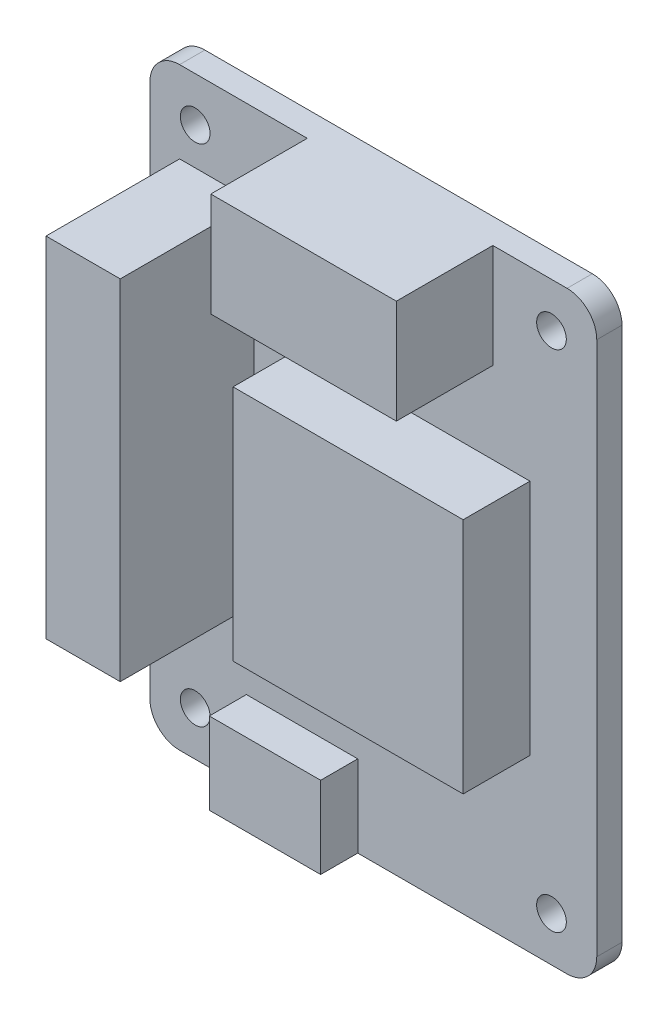
ISO-10303-21;
HEADER;
FILE_DESCRIPTION(('STEP AP214'),'2;1');
FILE_NAME('part.step','',(''),(''),'','','');
FILE_SCHEMA(('AUTOMOTIVE_DESIGN { 1 0 10303 214 1 1 1 1 }'));
ENDSEC;
DATA;
#1=APPLICATION_CONTEXT('core data for automotive mechanical design processes');
#2=APPLICATION_PROTOCOL_DEFINITION('international standard','automotive_design',2000,#1);
#3=PRODUCT_CONTEXT('',#1,'mechanical');
#4=PRODUCT('Part','Part','',(#3));
#5=PRODUCT_RELATED_PRODUCT_CATEGORY('part','',(#4));
#6=PRODUCT_DEFINITION_FORMATION('','',#4);
#7=PRODUCT_DEFINITION_CONTEXT('part definition',#1,'design');
#8=PRODUCT_DEFINITION('design','',#6,#7);
#9=PRODUCT_DEFINITION_SHAPE('','',#8);
#10=(LENGTH_UNIT() NAMED_UNIT(*) SI_UNIT(.MILLI.,.METRE.));
#11=(NAMED_UNIT(*) PLANE_ANGLE_UNIT() SI_UNIT($,.RADIAN.));
#12=(NAMED_UNIT(*) SI_UNIT($,.STERADIAN.) SOLID_ANGLE_UNIT());
#13=UNCERTAINTY_MEASURE_WITH_UNIT(LENGTH_MEASURE(1.E-05),#10,'distance_accuracy_value','');
#14=(GEOMETRIC_REPRESENTATION_CONTEXT(3) GLOBAL_UNCERTAINTY_ASSIGNED_CONTEXT((#13)) GLOBAL_UNIT_ASSIGNED_CONTEXT((#10,
#11,#12)) REPRESENTATION_CONTEXT('',''));
#15=CARTESIAN_POINT('',(0.,0.,0.));
#16=DIRECTION('',(0.,0.,1.));
#17=DIRECTION('',(1.,0.,0.));
#18=AXIS2_PLACEMENT_3D('',#15,#16,#17);
#19=CARTESIAN_POINT('',(0.,0.,1.7));
#20=DIRECTION('',(0.,0.,1.));
#21=DIRECTION('',(1.,0.,0.));
#22=AXIS2_PLACEMENT_3D('',#19,#20,#21);
#23=PLANE('',#22);
#24=CARTESIAN_POINT('',(-12.,-17.,1.7));
#25=DIRECTION('',(0.,0.,1.));
#26=DIRECTION('',(1.,0.,0.));
#27=AXIS2_PLACEMENT_3D('',#24,#25,#26);
#28=CIRCLE('',#27,1.);
#29=CARTESIAN_POINT('',(-11.,-17.,1.7));
#30=VERTEX_POINT('',#29);
#31=EDGE_CURVE('E321',#30,#30,#28,.T.);
#32=ORIENTED_EDGE('',*,*,#31,.F.);
#33=EDGE_LOOP('',(#32));
#34=FACE_BOUND('',#33,.T.);
#35=CARTESIAN_POINT('',(12.,17.,1.7));
#36=DIRECTION('',(0.,0.,1.));
#37=DIRECTION('',(1.,0.,0.));
#38=AXIS2_PLACEMENT_3D('',#35,#36,#37);
#39=CIRCLE('',#38,1.);
#40=CARTESIAN_POINT('',(13.,17.,1.7));
#41=VERTEX_POINT('',#40);
#42=EDGE_CURVE('E333',#41,#41,#39,.T.);
#43=ORIENTED_EDGE('',*,*,#42,.F.);
#44=EDGE_LOOP('',(#43));
#45=FACE_BOUND('',#44,.T.);
#46=CARTESIAN_POINT('',(-12.,17.,1.7));
#47=DIRECTION('',(0.,0.,1.));
#48=DIRECTION('',(1.,0.,0.));
#49=AXIS2_PLACEMENT_3D('',#46,#47,#48);
#50=CIRCLE('',#49,1.);
#51=CARTESIAN_POINT('',(-11.,17.,1.7));
#52=VERTEX_POINT('',#51);
#53=EDGE_CURVE('E327',#52,#52,#50,.T.);
#54=ORIENTED_EDGE('',*,*,#53,.F.);
#55=EDGE_LOOP('',(#54));
#56=FACE_BOUND('',#55,.T.);
#57=CARTESIAN_POINT('',(12.,-17.,1.7));
#58=DIRECTION('',(0.,0.,1.));
#59=DIRECTION('',(1.,0.,0.));
#60=AXIS2_PLACEMENT_3D('',#57,#58,#59);
#61=CIRCLE('',#60,1.);
#62=CARTESIAN_POINT('',(13.,-17.,1.7));
#63=VERTEX_POINT('',#62);
#64=EDGE_CURVE('E315',#63,#63,#61,.T.);
#65=ORIENTED_EDGE('',*,*,#64,.F.);
#66=EDGE_LOOP('',(#65));
#67=FACE_BOUND('',#66,.T.);
#68=DIRECTION('',(1.,0.,0.));
#69=VECTOR('',#68,1.);
#70=CARTESIAN_POINT('',(-8.05,-9.,1.7));
#71=LINE('',#70,#69);
#72=CARTESIAN_POINT('',(-13.05,-9.,1.7));
#73=VERTEX_POINT('',#72);
#74=CARTESIAN_POINT('',(-8.05,-9.,1.7));
#75=VERTEX_POINT('',#74);
#76=EDGE_CURVE('E299',#73,#75,#71,.T.);
#77=ORIENTED_EDGE('',*,*,#76,.F.);
#78=DIRECTION('',(0.,-1.,0.));
#79=VECTOR('',#78,1.);
#80=CARTESIAN_POINT('',(-13.05,-9.,1.7));
#81=LINE('',#80,#79);
#82=CARTESIAN_POINT('',(-13.05,14.5,1.7));
#83=VERTEX_POINT('',#82);
#84=EDGE_CURVE('E285',#83,#73,#81,.T.);
#85=ORIENTED_EDGE('',*,*,#84,.F.);
#86=DIRECTION('',(-1.,0.,0.));
#87=VECTOR('',#86,1.);
#88=CARTESIAN_POINT('',(-8.05,14.5,1.7));
#89=LINE('',#88,#87);
#90=CARTESIAN_POINT('',(-8.05,14.5,1.7));
#91=VERTEX_POINT('',#90);
#92=EDGE_CURVE('E290',#91,#83,#89,.T.);
#93=ORIENTED_EDGE('',*,*,#92,.F.);
#94=DIRECTION('',(0.,1.,0.));
#95=VECTOR('',#94,1.);
#96=CARTESIAN_POINT('',(-8.05,-9.,1.7));
#97=LINE('',#96,#95);
#98=EDGE_CURVE('E301',#75,#91,#97,.T.);
#99=ORIENTED_EDGE('',*,*,#98,.F.);
#100=EDGE_LOOP('',(#77,#85,#93,#99));
#101=FACE_BOUND('',#100,.T.);
#102=DIRECTION('',(1.,0.,0.));
#103=VECTOR('',#102,1.);
#104=CARTESIAN_POINT('',(10.55,-8.5,1.7));
#105=LINE('',#104,#103);
#106=CARTESIAN_POINT('',(-4.95,-8.5,1.7));
#107=VERTEX_POINT('',#106);
#108=CARTESIAN_POINT('',(10.55,-8.5,1.7));
#109=VERTEX_POINT('',#108);
#110=EDGE_CURVE('E270',#107,#109,#105,.T.);
#111=ORIENTED_EDGE('',*,*,#110,.F.);
#112=DIRECTION('',(0.,-1.,0.));
#113=VECTOR('',#112,1.);
#114=CARTESIAN_POINT('',(-4.95,-8.5,1.7));
#115=LINE('',#114,#113);
#116=CARTESIAN_POINT('',(-4.95,7.5,1.7));
#117=VERTEX_POINT('',#116);
#118=EDGE_CURVE('E256',#117,#107,#115,.T.);
#119=ORIENTED_EDGE('',*,*,#118,.F.);
#120=DIRECTION('',(-1.,0.,0.));
#121=VECTOR('',#120,1.);
#122=CARTESIAN_POINT('',(10.55,7.5,1.7));
#123=LINE('',#122,#121);
#124=CARTESIAN_POINT('',(10.55,7.5,1.7));
#125=VERTEX_POINT('',#124);
#126=EDGE_CURVE('E261',#125,#117,#123,.T.);
#127=ORIENTED_EDGE('',*,*,#126,.F.);
#128=DIRECTION('',(0.,1.,0.));
#129=VECTOR('',#128,1.);
#130=CARTESIAN_POINT('',(10.55,-8.5,1.7));
#131=LINE('',#130,#129);
#132=EDGE_CURVE('E272',#109,#125,#131,.T.);
#133=ORIENTED_EDGE('',*,*,#132,.F.);
#134=EDGE_LOOP('',(#111,#119,#127,#133));
#135=FACE_BOUND('',#134,.T.);
#136=DIRECTION('',(0.,-1.,0.));
#137=VECTOR('',#136,1.);
#138=CARTESIAN_POINT('',(-15.05,-20.,1.7));
#139=LINE('',#138,#137);
#140=CARTESIAN_POINT('',(-15.05,18.,1.7));
#141=VERTEX_POINT('',#140);
#142=CARTESIAN_POINT('',(-15.05,-18.,1.7));
#143=VERTEX_POINT('',#142);
#144=EDGE_CURVE('E339',#141,#143,#139,.T.);
#145=ORIENTED_EDGE('',*,*,#144,.T.);
#146=CARTESIAN_POINT('',(-13.05,-18.,1.7));
#147=DIRECTION('',(0.,0.,1.));
#148=DIRECTION('',(1.,0.,0.));
#149=AXIS2_PLACEMENT_3D('',#146,#147,#148);
#150=CIRCLE('',#149,2.);
#151=CARTESIAN_POINT('',(-13.05,-20.,1.7));
#152=VERTEX_POINT('',#151);
#153=EDGE_CURVE('E382',#143,#152,#150,.T.);
#154=ORIENTED_EDGE('',*,*,#153,.T.);
#155=DIRECTION('',(1.,0.,0.));
#156=VECTOR('',#155,1.);
#157=CARTESIAN_POINT('',(15.05,-20.,1.7));
#158=LINE('',#157,#156);
#159=CARTESIAN_POINT('',(-8.55,-20.,1.7));
#160=VERTEX_POINT('',#159);
#161=EDGE_CURVE('E343',#152,#160,#158,.T.);
#162=ORIENTED_EDGE('',*,*,#161,.T.);
#163=DIRECTION('',(0.,-1.,0.));
#164=VECTOR('',#163,1.);
#165=CARTESIAN_POINT('',(-8.55,-20.,1.7));
#166=LINE('',#165,#164);
#167=CARTESIAN_POINT('',(-8.55,-14.5,1.7));
#168=VERTEX_POINT('',#167);
#169=EDGE_CURVE('E214',#168,#160,#166,.T.);
#170=ORIENTED_EDGE('',*,*,#169,.F.);
#171=DIRECTION('',(-1.,0.,0.));
#172=VECTOR('',#171,1.);
#173=CARTESIAN_POINT('',(-8.55,-14.5,1.7));
#174=LINE('',#173,#172);
#175=CARTESIAN_POINT('',(-1.05,-14.5,1.7));
#176=VERTEX_POINT('',#175);
#177=EDGE_CURVE('E773',#176,#168,#174,.T.);
#178=ORIENTED_EDGE('',*,*,#177,.F.);
#179=DIRECTION('',(0.,1.,0.));
#180=VECTOR('',#179,1.);
#181=CARTESIAN_POINT('',(-1.05,-14.5,1.7));
#182=LINE('',#181,#180);
#183=CARTESIAN_POINT('',(-1.05,-20.,1.7));
#184=VERTEX_POINT('',#183);
#185=EDGE_CURVE('E775',#184,#176,#182,.T.);
#186=ORIENTED_EDGE('',*,*,#185,.F.);
#187=CARTESIAN_POINT('',(13.05,-20.,1.7));
#188=VERTEX_POINT('',#187);
#189=EDGE_CURVE('E219',#184,#188,#158,.T.);
#190=ORIENTED_EDGE('',*,*,#189,.T.);
#191=CARTESIAN_POINT('',(13.05,-18.,1.7));
#192=DIRECTION('',(0.,0.,1.));
#193=DIRECTION('',(1.,0.,0.));
#194=AXIS2_PLACEMENT_3D('',#191,#192,#193);
#195=CIRCLE('',#194,2.);
#196=CARTESIAN_POINT('',(15.05,-18.,1.7));
#197=VERTEX_POINT('',#196);
#198=EDGE_CURVE('E380',#188,#197,#195,.T.);
#199=ORIENTED_EDGE('',*,*,#198,.T.);
#200=DIRECTION('',(0.,1.,0.));
#201=VECTOR('',#200,1.);
#202=CARTESIAN_POINT('',(15.05,-20.,1.7));
#203=LINE('',#202,#201);
#204=CARTESIAN_POINT('',(15.05,18.,1.7));
#205=VERTEX_POINT('',#204);
#206=EDGE_CURVE('E345',#197,#205,#203,.T.);
#207=ORIENTED_EDGE('',*,*,#206,.T.);
#208=CARTESIAN_POINT('',(13.05,18.,1.7));
#209=DIRECTION('',(0.,0.,1.));
#210=DIRECTION('',(1.,0.,0.));
#211=AXIS2_PLACEMENT_3D('',#208,#209,#210);
#212=CIRCLE('',#211,2.);
#213=CARTESIAN_POINT('',(13.05,20.,1.7));
#214=VERTEX_POINT('',#213);
#215=EDGE_CURVE('E54',#205,#214,#212,.T.);
#216=ORIENTED_EDGE('',*,*,#215,.T.);
#217=DIRECTION('',(-1.,0.,0.));
#218=VECTOR('',#217,1.);
#219=CARTESIAN_POINT('',(15.05,20.,1.7));
#220=LINE('',#219,#218);
#221=CARTESIAN_POINT('',(8.05,20.,1.7));
#222=VERTEX_POINT('',#221);
#223=EDGE_CURVE('E348',#214,#222,#220,.T.);
#224=ORIENTED_EDGE('',*,*,#223,.T.);
#225=DIRECTION('',(0.,1.,0.));
#226=VECTOR('',#225,1.);
#227=CARTESIAN_POINT('',(8.05,13.,1.7));
#228=LINE('',#227,#226);
#229=CARTESIAN_POINT('',(8.05,13.,1.7));
#230=VERTEX_POINT('',#229);
#231=EDGE_CURVE('E234',#230,#222,#228,.T.);
#232=ORIENTED_EDGE('',*,*,#231,.F.);
#233=DIRECTION('',(1.,0.,0.));
#234=VECTOR('',#233,1.);
#235=CARTESIAN_POINT('',(-4.44999999999999,13.,1.7));
#236=LINE('',#235,#234);
#237=CARTESIAN_POINT('',(-4.44999999999999,13.,1.7));
#238=VERTEX_POINT('',#237);
#239=EDGE_CURVE('E224',#238,#230,#236,.T.);
#240=ORIENTED_EDGE('',*,*,#239,.F.);
#241=DIRECTION('',(0.,-1.,0.));
#242=VECTOR('',#241,1.);
#243=CARTESIAN_POINT('',(-4.45,20.,1.7));
#244=LINE('',#243,#242);
#245=CARTESIAN_POINT('',(-4.45,20.,1.7));
#246=VERTEX_POINT('',#245);
#247=EDGE_CURVE('E221',#246,#238,#244,.T.);
#248=ORIENTED_EDGE('',*,*,#247,.F.);
#249=CARTESIAN_POINT('',(-13.05,20.,1.7));
#250=VERTEX_POINT('',#249);
#251=EDGE_CURVE('E347',#246,#250,#220,.T.);
#252=ORIENTED_EDGE('',*,*,#251,.T.);
#253=CARTESIAN_POINT('',(-13.05,18.,1.7));
#254=DIRECTION('',(0.,0.,1.));
#255=DIRECTION('',(1.,0.,0.));
#256=AXIS2_PLACEMENT_3D('',#253,#254,#255);
#257=CIRCLE('',#256,2.);
#258=EDGE_CURVE('E378',#250,#141,#257,.T.);
#259=ORIENTED_EDGE('',*,*,#258,.T.);
#260=EDGE_LOOP('',(#145,#154,#162,#170,#178,#186,#190,#199,#207,#216,#224,#232,#240,#248,#252,#259));
#261=FACE_BOUND('',#260,.T.);
#262=ADVANCED_FACE('F33',(#34,#45,#56,#67,#101,#135,#261),#23,.T.);
#263=CARTESIAN_POINT('',(0.,0.,0.));
#264=DIRECTION('',(0.,0.,1.));
#265=DIRECTION('',(1.,0.,0.));
#266=AXIS2_PLACEMENT_3D('',#263,#264,#265);
#267=PLANE('',#266);
#268=DIRECTION('',(1.,0.,0.));
#269=VECTOR('',#268,1.);
#270=CARTESIAN_POINT('',(15.05,-20.,0.));
#271=LINE('',#270,#269);
#272=CARTESIAN_POINT('',(-13.05,-20.,0.));
#273=VERTEX_POINT('',#272);
#274=CARTESIAN_POINT('',(13.05,-20.,0.));
#275=VERTEX_POINT('',#274);
#276=EDGE_CURVE('E353',#273,#275,#271,.T.);
#277=ORIENTED_EDGE('',*,*,#276,.F.);
#278=CARTESIAN_POINT('',(-13.05,-18.,0.));
#279=DIRECTION('',(0.,0.,1.));
#280=DIRECTION('',(1.,0.,0.));
#281=AXIS2_PLACEMENT_3D('',#278,#279,#280);
#282=CIRCLE('',#281,2.);
#283=CARTESIAN_POINT('',(-15.05,-18.,0.));
#284=VERTEX_POINT('',#283);
#285=EDGE_CURVE('E370',#273,#284,#282,.F.);
#286=ORIENTED_EDGE('',*,*,#285,.T.);
#287=DIRECTION('',(0.,-1.,0.));
#288=VECTOR('',#287,1.);
#289=CARTESIAN_POINT('',(-15.05,-20.,0.));
#290=LINE('',#289,#288);
#291=CARTESIAN_POINT('',(-15.05,18.,0.));
#292=VERTEX_POINT('',#291);
#293=EDGE_CURVE('E336',#292,#284,#290,.T.);
#294=ORIENTED_EDGE('',*,*,#293,.F.);
#295=CARTESIAN_POINT('',(-13.05,18.,0.));
#296=DIRECTION('',(0.,0.,1.));
#297=DIRECTION('',(1.,0.,0.));
#298=AXIS2_PLACEMENT_3D('',#295,#296,#297);
#299=CIRCLE('',#298,2.);
#300=CARTESIAN_POINT('',(-13.05,20.,0.));
#301=VERTEX_POINT('',#300);
#302=EDGE_CURVE('E366',#292,#301,#299,.F.);
#303=ORIENTED_EDGE('',*,*,#302,.T.);
#304=DIRECTION('',(-1.,0.,0.));
#305=VECTOR('',#304,1.);
#306=CARTESIAN_POINT('',(15.05,20.,0.));
#307=LINE('',#306,#305);
#308=CARTESIAN_POINT('',(13.05,20.,0.));
#309=VERTEX_POINT('',#308);
#310=EDGE_CURVE('E342',#309,#301,#307,.T.);
#311=ORIENTED_EDGE('',*,*,#310,.F.);
#312=CARTESIAN_POINT('',(13.05,18.,0.));
#313=DIRECTION('',(0.,0.,1.));
#314=DIRECTION('',(1.,0.,0.));
#315=AXIS2_PLACEMENT_3D('',#312,#313,#314);
#316=CIRCLE('',#315,2.);
#317=CARTESIAN_POINT('',(15.05,18.,0.));
#318=VERTEX_POINT('',#317);
#319=EDGE_CURVE('E364',#309,#318,#316,.F.);
#320=ORIENTED_EDGE('',*,*,#319,.T.);
#321=DIRECTION('',(0.,1.,0.));
#322=VECTOR('',#321,1.);
#323=CARTESIAN_POINT('',(15.05,-20.,0.));
#324=LINE('',#323,#322);
#325=CARTESIAN_POINT('',(15.05,-18.,0.));
#326=VERTEX_POINT('',#325);
#327=EDGE_CURVE('E356',#326,#318,#324,.T.);
#328=ORIENTED_EDGE('',*,*,#327,.F.);
#329=CARTESIAN_POINT('',(13.05,-18.,0.));
#330=DIRECTION('',(0.,0.,1.));
#331=DIRECTION('',(1.,0.,0.));
#332=AXIS2_PLACEMENT_3D('',#329,#330,#331);
#333=CIRCLE('',#332,2.);
#334=EDGE_CURVE('E368',#326,#275,#333,.F.);
#335=ORIENTED_EDGE('',*,*,#334,.T.);
#336=EDGE_LOOP('',(#277,#286,#294,#303,#311,#320,#328,#335));
#337=FACE_BOUND('',#336,.T.);
#338=CARTESIAN_POINT('',(12.,17.,0.));
#339=DIRECTION('',(0.,0.,1.));
#340=DIRECTION('',(1.,0.,0.));
#341=AXIS2_PLACEMENT_3D('',#338,#339,#340);
#342=CIRCLE('',#341,1.);
#343=CARTESIAN_POINT('',(13.,17.,0.));
#344=VERTEX_POINT('',#343);
#345=EDGE_CURVE('E330',#344,#344,#342,.T.);
#346=ORIENTED_EDGE('',*,*,#345,.T.);
#347=EDGE_LOOP('',(#346));
#348=FACE_BOUND('',#347,.T.);
#349=CARTESIAN_POINT('',(-12.,17.,0.));
#350=DIRECTION('',(0.,0.,1.));
#351=DIRECTION('',(1.,0.,0.));
#352=AXIS2_PLACEMENT_3D('',#349,#350,#351);
#353=CIRCLE('',#352,1.);
#354=CARTESIAN_POINT('',(-11.,17.,0.));
#355=VERTEX_POINT('',#354);
#356=EDGE_CURVE('E324',#355,#355,#353,.T.);
#357=ORIENTED_EDGE('',*,*,#356,.T.);
#358=EDGE_LOOP('',(#357));
#359=FACE_BOUND('',#358,.T.);
#360=CARTESIAN_POINT('',(-12.,-17.,0.));
#361=DIRECTION('',(0.,0.,1.));
#362=DIRECTION('',(1.,0.,0.));
#363=AXIS2_PLACEMENT_3D('',#360,#361,#362);
#364=CIRCLE('',#363,1.);
#365=CARTESIAN_POINT('',(-11.,-17.,0.));
#366=VERTEX_POINT('',#365);
#367=EDGE_CURVE('E318',#366,#366,#364,.T.);
#368=ORIENTED_EDGE('',*,*,#367,.T.);
#369=EDGE_LOOP('',(#368));
#370=FACE_BOUND('',#369,.T.);
#371=CARTESIAN_POINT('',(12.,-17.,0.));
#372=DIRECTION('',(0.,0.,1.));
#373=DIRECTION('',(1.,0.,0.));
#374=AXIS2_PLACEMENT_3D('',#371,#372,#373);
#375=CIRCLE('',#374,1.);
#376=CARTESIAN_POINT('',(13.,-17.,0.));
#377=VERTEX_POINT('',#376);
#378=EDGE_CURVE('E314',#377,#377,#375,.T.);
#379=ORIENTED_EDGE('',*,*,#378,.T.);
#380=EDGE_LOOP('',(#379));
#381=FACE_BOUND('',#380,.T.);
#382=ADVANCED_FACE('F395',(#337,#348,#359,#370,#381),#267,.F.);
#383=CARTESIAN_POINT('',(-15.05,-20.,1.7));
#384=DIRECTION('',(1.,0.,0.));
#385=DIRECTION('',(0.,0.,-1.));
#386=AXIS2_PLACEMENT_3D('',#383,#384,#385);
#387=PLANE('',#386);
#388=ORIENTED_EDGE('',*,*,#293,.T.);
#389=DIRECTION('',(0.,0.,-1.));
#390=VECTOR('',#389,1.);
#391=CARTESIAN_POINT('',(-15.05,-18.,1.7));
#392=LINE('',#391,#390);
#393=EDGE_CURVE('E375',#284,#143,#392,.F.);
#394=ORIENTED_EDGE('',*,*,#393,.T.);
#395=ORIENTED_EDGE('',*,*,#144,.F.);
#396=DIRECTION('',(0.,0.,-1.));
#397=VECTOR('',#396,1.);
#398=CARTESIAN_POINT('',(-15.05,18.,1.7));
#399=LINE('',#398,#397);
#400=EDGE_CURVE('E372',#141,#292,#399,.T.);
#401=ORIENTED_EDGE('',*,*,#400,.T.);
#402=EDGE_LOOP('',(#388,#394,#395,#401));
#403=FACE_BOUND('',#402,.T.);
#404=ADVANCED_FACE('F405',(#403),#387,.F.);
#405=CARTESIAN_POINT('',(15.05,-20.,1.7));
#406=DIRECTION('',(0.,1.,0.));
#407=DIRECTION('',(-1.,0.,0.));
#408=AXIS2_PLACEMENT_3D('',#405,#406,#407);
#409=PLANE('',#408);
#410=ORIENTED_EDGE('',*,*,#161,.F.);
#411=DIRECTION('',(0.,0.,-1.));
#412=VECTOR('',#411,1.);
#413=CARTESIAN_POINT('',(-13.05,-20.,1.7));
#414=LINE('',#413,#412);
#415=EDGE_CURVE('E361',#152,#273,#414,.T.);
#416=ORIENTED_EDGE('',*,*,#415,.T.);
#417=ORIENTED_EDGE('',*,*,#276,.T.);
#418=DIRECTION('',(0.,0.,-1.));
#419=VECTOR('',#418,1.);
#420=CARTESIAN_POINT('',(13.05,-20.,1.7));
#421=LINE('',#420,#419);
#422=EDGE_CURVE('E350',#275,#188,#421,.F.);
#423=ORIENTED_EDGE('',*,*,#422,.T.);
#424=ORIENTED_EDGE('',*,*,#189,.F.);
#425=DIRECTION('',(0.,0.,-1.));
#426=VECTOR('',#425,1.);
#427=CARTESIAN_POINT('',(-1.05,-20.,4.2));
#428=LINE('',#427,#426);
#429=CARTESIAN_POINT('',(-1.05,-20.,4.2));
#430=VERTEX_POINT('',#429);
#431=EDGE_CURVE('E199',#430,#184,#428,.T.);
#432=ORIENTED_EDGE('',*,*,#431,.F.);
#433=DIRECTION('',(1.,0.,0.));
#434=VECTOR('',#433,1.);
#435=CARTESIAN_POINT('',(-1.05,-20.,4.2));
#436=LINE('',#435,#434);
#437=CARTESIAN_POINT('',(-8.55,-20.,4.2));
#438=VERTEX_POINT('',#437);
#439=EDGE_CURVE('E205',#438,#430,#436,.T.);
#440=ORIENTED_EDGE('',*,*,#439,.F.);
#441=DIRECTION('',(0.,0.,-1.));
#442=VECTOR('',#441,1.);
#443=CARTESIAN_POINT('',(-8.55,-20.,4.2));
#444=LINE('',#443,#442);
#445=EDGE_CURVE('E778',#438,#160,#444,.T.);
#446=ORIENTED_EDGE('',*,*,#445,.T.);
#447=EDGE_LOOP('',(#410,#416,#417,#423,#424,#432,#440,#446));
#448=FACE_BOUND('',#447,.T.);
#449=ADVANCED_FACE('F217',(#448),#409,.F.);
#450=CARTESIAN_POINT('',(15.05,-20.,1.7));
#451=DIRECTION('',(-1.,0.,0.));
#452=DIRECTION('',(0.,0.,1.));
#453=AXIS2_PLACEMENT_3D('',#450,#451,#452);
#454=PLANE('',#453);
#455=ORIENTED_EDGE('',*,*,#206,.F.);
#456=DIRECTION('',(0.,0.,-1.));
#457=VECTOR('',#456,1.);
#458=CARTESIAN_POINT('',(15.05,-18.,1.7));
#459=LINE('',#458,#457);
#460=EDGE_CURVE('E386',#197,#326,#459,.T.);
#461=ORIENTED_EDGE('',*,*,#460,.T.);
#462=ORIENTED_EDGE('',*,*,#327,.T.);
#463=DIRECTION('',(0.,0.,-1.));
#464=VECTOR('',#463,1.);
#465=CARTESIAN_POINT('',(15.05,18.,1.7));
#466=LINE('',#465,#464);
#467=EDGE_CURVE('E384',#318,#205,#466,.F.);
#468=ORIENTED_EDGE('',*,*,#467,.T.);
#469=EDGE_LOOP('',(#455,#461,#462,#468));
#470=FACE_BOUND('',#469,.T.);
#471=ADVANCED_FACE('F418',(#470),#454,.F.);
#472=CARTESIAN_POINT('',(15.05,20.,1.7));
#473=DIRECTION('',(0.,-1.,0.));
#474=DIRECTION('',(1.,0.,0.));
#475=AXIS2_PLACEMENT_3D('',#472,#473,#474);
#476=PLANE('',#475);
#477=ORIENTED_EDGE('',*,*,#310,.T.);
#478=DIRECTION('',(0.,0.,-1.));
#479=VECTOR('',#478,1.);
#480=CARTESIAN_POINT('',(-13.05,20.,1.7));
#481=LINE('',#480,#479);
#482=EDGE_CURVE('E11',#301,#250,#481,.F.);
#483=ORIENTED_EDGE('',*,*,#482,.T.);
#484=ORIENTED_EDGE('',*,*,#251,.F.);
#485=DIRECTION('',(0.,0.,-1.));
#486=VECTOR('',#485,1.);
#487=CARTESIAN_POINT('',(-4.45,20.,8.2));
#488=LINE('',#487,#486);
#489=CARTESIAN_POINT('',(-4.45,20.,8.2));
#490=VERTEX_POINT('',#489);
#491=EDGE_CURVE('E253',#490,#246,#488,.T.);
#492=ORIENTED_EDGE('',*,*,#491,.F.);
#493=DIRECTION('',(-1.,0.,0.));
#494=VECTOR('',#493,1.);
#495=CARTESIAN_POINT('',(8.05,20.,8.2));
#496=LINE('',#495,#494);
#497=CARTESIAN_POINT('',(8.05,20.,8.2));
#498=VERTEX_POINT('',#497);
#499=EDGE_CURVE('E230',#498,#490,#496,.T.);
#500=ORIENTED_EDGE('',*,*,#499,.F.);
#501=DIRECTION('',(0.,0.,-1.));
#502=VECTOR('',#501,1.);
#503=CARTESIAN_POINT('',(8.05,20.,8.2));
#504=LINE('',#503,#502);
#505=EDGE_CURVE('E239',#498,#222,#504,.T.);
#506=ORIENTED_EDGE('',*,*,#505,.T.);
#507=ORIENTED_EDGE('',*,*,#223,.F.);
#508=DIRECTION('',(0.,0.,-1.));
#509=VECTOR('',#508,1.);
#510=CARTESIAN_POINT('',(13.05,20.,1.7));
#511=LINE('',#510,#509);
#512=EDGE_CURVE('E41',#214,#309,#511,.T.);
#513=ORIENTED_EDGE('',*,*,#512,.T.);
#514=EDGE_LOOP('',(#477,#483,#484,#492,#500,#506,#507,#513));
#515=FACE_BOUND('',#514,.T.);
#516=ADVANCED_FACE('F391',(#515),#476,.F.);
#517=CARTESIAN_POINT('',(12.,17.,1.7));
#518=DIRECTION('',(0.,0.,-1.));
#519=DIRECTION('',(-1.,0.,0.));
#520=AXIS2_PLACEMENT_3D('',#517,#518,#519);
#521=CYLINDRICAL_SURFACE('',#520,1.);
#522=ORIENTED_EDGE('',*,*,#42,.T.);
#523=EDGE_LOOP('',(#522));
#524=FACE_BOUND('',#523,.T.);
#525=ORIENTED_EDGE('',*,*,#345,.F.);
#526=EDGE_LOOP('',(#525));
#527=FACE_BOUND('',#526,.T.);
#528=ADVANCED_FACE('F435',(#524,#527),#521,.F.);
#529=CARTESIAN_POINT('',(-12.,17.,1.7));
#530=DIRECTION('',(0.,0.,-1.));
#531=DIRECTION('',(-1.,0.,0.));
#532=AXIS2_PLACEMENT_3D('',#529,#530,#531);
#533=CYLINDRICAL_SURFACE('',#532,1.);
#534=ORIENTED_EDGE('',*,*,#53,.T.);
#535=EDGE_LOOP('',(#534));
#536=FACE_BOUND('',#535,.T.);
#537=ORIENTED_EDGE('',*,*,#356,.F.);
#538=EDGE_LOOP('',(#537));
#539=FACE_BOUND('',#538,.T.);
#540=ADVANCED_FACE('F667',(#536,#539),#533,.F.);
#541=CARTESIAN_POINT('',(-12.,-17.,1.7));
#542=DIRECTION('',(0.,0.,-1.));
#543=DIRECTION('',(-1.,0.,0.));
#544=AXIS2_PLACEMENT_3D('',#541,#542,#543);
#545=CYLINDRICAL_SURFACE('',#544,1.);
#546=ORIENTED_EDGE('',*,*,#31,.T.);
#547=EDGE_LOOP('',(#546));
#548=FACE_BOUND('',#547,.T.);
#549=ORIENTED_EDGE('',*,*,#367,.F.);
#550=EDGE_LOOP('',(#549));
#551=FACE_BOUND('',#550,.T.);
#552=ADVANCED_FACE('F658',(#548,#551),#545,.F.);
#553=CARTESIAN_POINT('',(12.,-17.,1.7));
#554=DIRECTION('',(0.,0.,-1.));
#555=DIRECTION('',(-1.,0.,0.));
#556=AXIS2_PLACEMENT_3D('',#553,#554,#555);
#557=CYLINDRICAL_SURFACE('',#556,1.);
#558=ORIENTED_EDGE('',*,*,#64,.T.);
#559=EDGE_LOOP('',(#558));
#560=FACE_BOUND('',#559,.T.);
#561=ORIENTED_EDGE('',*,*,#378,.F.);
#562=EDGE_LOOP('',(#561));
#563=FACE_BOUND('',#562,.T.);
#564=ADVANCED_FACE('F649',(#560,#563),#557,.F.);
#565=CARTESIAN_POINT('',(-13.05,-9.,10.7));
#566=DIRECTION('',(1.,0.,0.));
#567=DIRECTION('',(0.,1.,0.));
#568=AXIS2_PLACEMENT_3D('',#565,#566,#567);
#569=PLANE('',#568);
#570=ORIENTED_EDGE('',*,*,#84,.T.);
#571=DIRECTION('',(0.,0.,-1.));
#572=VECTOR('',#571,1.);
#573=CARTESIAN_POINT('',(-13.05,-9.,10.7));
#574=LINE('',#573,#572);
#575=CARTESIAN_POINT('',(-13.05,-9.,10.7));
#576=VERTEX_POINT('',#575);
#577=EDGE_CURVE('E312',#576,#73,#574,.T.);
#578=ORIENTED_EDGE('',*,*,#577,.F.);
#579=DIRECTION('',(0.,-1.,0.));
#580=VECTOR('',#579,1.);
#581=CARTESIAN_POINT('',(-13.05,-9.,10.7));
#582=LINE('',#581,#580);
#583=CARTESIAN_POINT('',(-13.05,14.5,10.7));
#584=VERTEX_POINT('',#583);
#585=EDGE_CURVE('E286',#584,#576,#582,.T.);
#586=ORIENTED_EDGE('',*,*,#585,.F.);
#587=DIRECTION('',(0.,0.,-1.));
#588=VECTOR('',#587,1.);
#589=CARTESIAN_POINT('',(-13.05,14.5,10.7));
#590=LINE('',#589,#588);
#591=EDGE_CURVE('E296',#584,#83,#590,.T.);
#592=ORIENTED_EDGE('',*,*,#591,.T.);
#593=EDGE_LOOP('',(#570,#578,#586,#592));
#594=FACE_BOUND('',#593,.T.);
#595=ADVANCED_FACE('F640',(#594),#569,.F.);
#596=CARTESIAN_POINT('',(-8.05,-9.,10.7));
#597=DIRECTION('',(0.,1.,0.));
#598=DIRECTION('',(-1.,0.,0.));
#599=AXIS2_PLACEMENT_3D('',#596,#597,#598);
#600=PLANE('',#599);
#601=ORIENTED_EDGE('',*,*,#76,.T.);
#602=DIRECTION('',(0.,0.,-1.));
#603=VECTOR('',#602,1.);
#604=CARTESIAN_POINT('',(-8.05,-9.,10.7));
#605=LINE('',#604,#603);
#606=CARTESIAN_POINT('',(-8.05,-9.,10.7));
#607=VERTEX_POINT('',#606);
#608=EDGE_CURVE('E309',#607,#75,#605,.T.);
#609=ORIENTED_EDGE('',*,*,#608,.F.);
#610=DIRECTION('',(1.,0.,0.));
#611=VECTOR('',#610,1.);
#612=CARTESIAN_POINT('',(-8.05,-9.,10.7));
#613=LINE('',#612,#611);
#614=EDGE_CURVE('E289',#576,#607,#613,.T.);
#615=ORIENTED_EDGE('',*,*,#614,.F.);
#616=ORIENTED_EDGE('',*,*,#577,.T.);
#617=EDGE_LOOP('',(#601,#609,#615,#616));
#618=FACE_BOUND('',#617,.T.);
#619=ADVANCED_FACE('F631',(#618),#600,.F.);
#620=CARTESIAN_POINT('',(-8.05,-9.,10.7));
#621=DIRECTION('',(-1.,0.,0.));
#622=DIRECTION('',(0.,0.,1.));
#623=AXIS2_PLACEMENT_3D('',#620,#621,#622);
#624=PLANE('',#623);
#625=ORIENTED_EDGE('',*,*,#98,.T.);
#626=DIRECTION('',(0.,0.,-1.));
#627=VECTOR('',#626,1.);
#628=CARTESIAN_POINT('',(-8.05,14.5,10.7));
#629=LINE('',#628,#627);
#630=CARTESIAN_POINT('',(-8.05,14.5,10.7));
#631=VERTEX_POINT('',#630);
#632=EDGE_CURVE('E307',#631,#91,#629,.T.);
#633=ORIENTED_EDGE('',*,*,#632,.F.);
#634=DIRECTION('',(0.,1.,0.));
#635=VECTOR('',#634,1.);
#636=CARTESIAN_POINT('',(-8.05,-9.,10.7));
#637=LINE('',#636,#635);
#638=EDGE_CURVE('E292',#607,#631,#637,.T.);
#639=ORIENTED_EDGE('',*,*,#638,.F.);
#640=ORIENTED_EDGE('',*,*,#608,.T.);
#641=EDGE_LOOP('',(#625,#633,#639,#640));
#642=FACE_BOUND('',#641,.T.);
#643=ADVANCED_FACE('F622',(#642),#624,.F.);
#644=CARTESIAN_POINT('',(-8.05,14.5,10.7));
#645=DIRECTION('',(0.,-1.,0.));
#646=DIRECTION('',(0.,0.,-1.));
#647=AXIS2_PLACEMENT_3D('',#644,#645,#646);
#648=PLANE('',#647);
#649=ORIENTED_EDGE('',*,*,#92,.T.);
#650=ORIENTED_EDGE('',*,*,#591,.F.);
#651=DIRECTION('',(-1.,0.,0.));
#652=VECTOR('',#651,1.);
#653=CARTESIAN_POINT('',(-8.05,14.5,10.7));
#654=LINE('',#653,#652);
#655=EDGE_CURVE('E294',#631,#584,#654,.T.);
#656=ORIENTED_EDGE('',*,*,#655,.F.);
#657=ORIENTED_EDGE('',*,*,#632,.T.);
#658=EDGE_LOOP('',(#649,#650,#656,#657));
#659=FACE_BOUND('',#658,.T.);
#660=ADVANCED_FACE('F613',(#659),#648,.F.);
#661=CARTESIAN_POINT('',(0.,0.,10.7));
#662=DIRECTION('',(0.,0.,1.));
#663=DIRECTION('',(1.,0.,0.));
#664=AXIS2_PLACEMENT_3D('',#661,#662,#663);
#665=PLANE('',#664);
#666=ORIENTED_EDGE('',*,*,#585,.T.);
#667=ORIENTED_EDGE('',*,*,#614,.T.);
#668=ORIENTED_EDGE('',*,*,#638,.T.);
#669=ORIENTED_EDGE('',*,*,#655,.T.);
#670=EDGE_LOOP('',(#666,#667,#668,#669));
#671=FACE_BOUND('',#670,.T.);
#672=ADVANCED_FACE('F604',(#671),#665,.T.);
#673=CARTESIAN_POINT('',(-4.95,-8.5,6.2));
#674=DIRECTION('',(1.,0.,0.));
#675=DIRECTION('',(0.,0.,-1.));
#676=AXIS2_PLACEMENT_3D('',#673,#674,#675);
#677=PLANE('',#676);
#678=ORIENTED_EDGE('',*,*,#118,.T.);
#679=DIRECTION('',(0.,0.,-1.));
#680=VECTOR('',#679,1.);
#681=CARTESIAN_POINT('',(-4.95,-8.5,6.2));
#682=LINE('',#681,#680);
#683=CARTESIAN_POINT('',(-4.95,-8.5,6.2));
#684=VERTEX_POINT('',#683);
#685=EDGE_CURVE('E283',#684,#107,#682,.T.);
#686=ORIENTED_EDGE('',*,*,#685,.F.);
#687=DIRECTION('',(0.,-1.,0.));
#688=VECTOR('',#687,1.);
#689=CARTESIAN_POINT('',(-4.95,-8.5,6.2));
#690=LINE('',#689,#688);
#691=CARTESIAN_POINT('',(-4.95,7.5,6.2));
#692=VERTEX_POINT('',#691);
#693=EDGE_CURVE('E257',#692,#684,#690,.T.);
#694=ORIENTED_EDGE('',*,*,#693,.F.);
#695=DIRECTION('',(0.,0.,-1.));
#696=VECTOR('',#695,1.);
#697=CARTESIAN_POINT('',(-4.95,7.5,6.2));
#698=LINE('',#697,#696);
#699=EDGE_CURVE('E267',#692,#117,#698,.T.);
#700=ORIENTED_EDGE('',*,*,#699,.T.);
#701=EDGE_LOOP('',(#678,#686,#694,#700));
#702=FACE_BOUND('',#701,.T.);
#703=ADVANCED_FACE('F595',(#702),#677,.F.);
#704=CARTESIAN_POINT('',(10.55,-8.5,6.2));
#705=DIRECTION('',(0.,1.,0.));
#706=DIRECTION('',(-1.,0.,0.));
#707=AXIS2_PLACEMENT_3D('',#704,#705,#706);
#708=PLANE('',#707);
#709=ORIENTED_EDGE('',*,*,#110,.T.);
#710=DIRECTION('',(0.,0.,-1.));
#711=VECTOR('',#710,1.);
#712=CARTESIAN_POINT('',(10.55,-8.5,6.2));
#713=LINE('',#712,#711);
#714=CARTESIAN_POINT('',(10.55,-8.5,6.2));
#715=VERTEX_POINT('',#714);
#716=EDGE_CURVE('E280',#715,#109,#713,.T.);
#717=ORIENTED_EDGE('',*,*,#716,.F.);
#718=DIRECTION('',(1.,0.,0.));
#719=VECTOR('',#718,1.);
#720=CARTESIAN_POINT('',(10.55,-8.5,6.2));
#721=LINE('',#720,#719);
#722=EDGE_CURVE('E260',#684,#715,#721,.T.);
#723=ORIENTED_EDGE('',*,*,#722,.F.);
#724=ORIENTED_EDGE('',*,*,#685,.T.);
#725=EDGE_LOOP('',(#709,#717,#723,#724));
#726=FACE_BOUND('',#725,.T.);
#727=ADVANCED_FACE('F586',(#726),#708,.F.);
#728=CARTESIAN_POINT('',(10.55,-8.5,6.2));
#729=DIRECTION('',(-1.,0.,0.));
#730=DIRECTION('',(0.,0.,1.));
#731=AXIS2_PLACEMENT_3D('',#728,#729,#730);
#732=PLANE('',#731);
#733=ORIENTED_EDGE('',*,*,#132,.T.);
#734=DIRECTION('',(0.,0.,-1.));
#735=VECTOR('',#734,1.);
#736=CARTESIAN_POINT('',(10.55,7.5,6.2));
#737=LINE('',#736,#735);
#738=CARTESIAN_POINT('',(10.55,7.5,6.2));
#739=VERTEX_POINT('',#738);
#740=EDGE_CURVE('E278',#739,#125,#737,.T.);
#741=ORIENTED_EDGE('',*,*,#740,.F.);
#742=DIRECTION('',(0.,1.,0.));
#743=VECTOR('',#742,1.);
#744=CARTESIAN_POINT('',(10.55,-8.5,6.2));
#745=LINE('',#744,#743);
#746=EDGE_CURVE('E263',#715,#739,#745,.T.);
#747=ORIENTED_EDGE('',*,*,#746,.F.);
#748=ORIENTED_EDGE('',*,*,#716,.T.);
#749=EDGE_LOOP('',(#733,#741,#747,#748));
#750=FACE_BOUND('',#749,.T.);
#751=ADVANCED_FACE('F577',(#750),#732,.F.);
#752=CARTESIAN_POINT('',(10.55,7.5,6.2));
#753=DIRECTION('',(0.,-1.,0.));
#754=DIRECTION('',(1.,0.,0.));
#755=AXIS2_PLACEMENT_3D('',#752,#753,#754);
#756=PLANE('',#755);
#757=ORIENTED_EDGE('',*,*,#126,.T.);
#758=ORIENTED_EDGE('',*,*,#699,.F.);
#759=DIRECTION('',(-1.,0.,0.));
#760=VECTOR('',#759,1.);
#761=CARTESIAN_POINT('',(10.55,7.5,6.2));
#762=LINE('',#761,#760);
#763=EDGE_CURVE('E265',#739,#692,#762,.T.);
#764=ORIENTED_EDGE('',*,*,#763,.F.);
#765=ORIENTED_EDGE('',*,*,#740,.T.);
#766=EDGE_LOOP('',(#757,#758,#764,#765));
#767=FACE_BOUND('',#766,.T.);
#768=ADVANCED_FACE('F568',(#767),#756,.F.);
#769=CARTESIAN_POINT('',(0.,0.,6.2));
#770=DIRECTION('',(0.,0.,1.));
#771=DIRECTION('',(1.,0.,0.));
#772=AXIS2_PLACEMENT_3D('',#769,#770,#771);
#773=PLANE('',#772);
#774=ORIENTED_EDGE('',*,*,#693,.T.);
#775=ORIENTED_EDGE('',*,*,#722,.T.);
#776=ORIENTED_EDGE('',*,*,#746,.T.);
#777=ORIENTED_EDGE('',*,*,#763,.T.);
#778=EDGE_LOOP('',(#774,#775,#776,#777));
#779=FACE_BOUND('',#778,.T.);
#780=ADVANCED_FACE('F550',(#779),#773,.T.);
#781=CARTESIAN_POINT('',(-4.45,20.,8.2));
#782=DIRECTION('',(1.,0.,0.));
#783=DIRECTION('',(0.,1.,0.));
#784=AXIS2_PLACEMENT_3D('',#781,#782,#783);
#785=PLANE('',#784);
#786=ORIENTED_EDGE('',*,*,#247,.T.);
#787=DIRECTION('',(0.,0.,-1.));
#788=VECTOR('',#787,1.);
#789=CARTESIAN_POINT('',(-4.44999999999999,13.,8.2));
#790=LINE('',#789,#788);
#791=CARTESIAN_POINT('',(-4.44999999999999,13.,8.2));
#792=VERTEX_POINT('',#791);
#793=EDGE_CURVE('E250',#792,#238,#790,.T.);
#794=ORIENTED_EDGE('',*,*,#793,.F.);
#795=DIRECTION('',(0.,-1.,0.));
#796=VECTOR('',#795,1.);
#797=CARTESIAN_POINT('',(-4.45,20.,8.2));
#798=LINE('',#797,#796);
#799=EDGE_CURVE('E233',#490,#792,#798,.T.);
#800=ORIENTED_EDGE('',*,*,#799,.F.);
#801=ORIENTED_EDGE('',*,*,#491,.T.);
#802=EDGE_LOOP('',(#786,#794,#800,#801));
#803=FACE_BOUND('',#802,.T.);
#804=ADVANCED_FACE('F541',(#803),#785,.F.);
#805=CARTESIAN_POINT('',(-4.44999999999999,13.,8.2));
#806=DIRECTION('',(0.,1.,0.));
#807=DIRECTION('',(0.,0.,1.));
#808=AXIS2_PLACEMENT_3D('',#805,#806,#807);
#809=PLANE('',#808);
#810=ORIENTED_EDGE('',*,*,#239,.T.);
#811=DIRECTION('',(0.,0.,-1.));
#812=VECTOR('',#811,1.);
#813=CARTESIAN_POINT('',(8.05,13.,8.2));
#814=LINE('',#813,#812);
#815=CARTESIAN_POINT('',(8.05,13.,8.2));
#816=VERTEX_POINT('',#815);
#817=EDGE_CURVE('E247',#816,#230,#814,.T.);
#818=ORIENTED_EDGE('',*,*,#817,.F.);
#819=DIRECTION('',(1.,0.,0.));
#820=VECTOR('',#819,1.);
#821=CARTESIAN_POINT('',(-4.44999999999999,13.,8.2));
#822=LINE('',#821,#820);
#823=EDGE_CURVE('E236',#792,#816,#822,.T.);
#824=ORIENTED_EDGE('',*,*,#823,.F.);
#825=ORIENTED_EDGE('',*,*,#793,.T.);
#826=EDGE_LOOP('',(#810,#818,#824,#825));
#827=FACE_BOUND('',#826,.T.);
#828=ADVANCED_FACE('F532',(#827),#809,.F.);
#829=CARTESIAN_POINT('',(8.05,13.,8.2));
#830=DIRECTION('',(-1.,0.,0.));
#831=DIRECTION('',(0.,0.,1.));
#832=AXIS2_PLACEMENT_3D('',#829,#830,#831);
#833=PLANE('',#832);
#834=ORIENTED_EDGE('',*,*,#231,.T.);
#835=ORIENTED_EDGE('',*,*,#505,.F.);
#836=DIRECTION('',(0.,1.,0.));
#837=VECTOR('',#836,1.);
#838=CARTESIAN_POINT('',(8.05,13.,8.2));
#839=LINE('',#838,#837);
#840=EDGE_CURVE('E238',#816,#498,#839,.T.);
#841=ORIENTED_EDGE('',*,*,#840,.F.);
#842=ORIENTED_EDGE('',*,*,#817,.T.);
#843=EDGE_LOOP('',(#834,#835,#841,#842));
#844=FACE_BOUND('',#843,.T.);
#845=ADVANCED_FACE('F523',(#844),#833,.F.);
#846=CARTESIAN_POINT('',(0.,0.,8.2));
#847=DIRECTION('',(0.,0.,1.));
#848=DIRECTION('',(1.,0.,0.));
#849=AXIS2_PLACEMENT_3D('',#846,#847,#848);
#850=PLANE('',#849);
#851=ORIENTED_EDGE('',*,*,#499,.T.);
#852=ORIENTED_EDGE('',*,*,#799,.T.);
#853=ORIENTED_EDGE('',*,*,#823,.T.);
#854=ORIENTED_EDGE('',*,*,#840,.T.);
#855=EDGE_LOOP('',(#851,#852,#853,#854));
#856=FACE_BOUND('',#855,.T.);
#857=ADVANCED_FACE('F501',(#856),#850,.T.);
#858=CARTESIAN_POINT('',(-1.05,-14.5,4.2));
#859=DIRECTION('',(-1.,0.,0.));
#860=DIRECTION('',(0.,-1.,0.));
#861=AXIS2_PLACEMENT_3D('',#858,#859,#860);
#862=PLANE('',#861);
#863=ORIENTED_EDGE('',*,*,#185,.T.);
#864=DIRECTION('',(0.,0.,-1.));
#865=VECTOR('',#864,1.);
#866=CARTESIAN_POINT('',(-1.05,-14.5,4.2));
#867=LINE('',#866,#865);
#868=CARTESIAN_POINT('',(-1.05,-14.5,4.2));
#869=VERTEX_POINT('',#868);
#870=EDGE_CURVE('E201',#869,#176,#867,.T.);
#871=ORIENTED_EDGE('',*,*,#870,.F.);
#872=DIRECTION('',(0.,1.,0.));
#873=VECTOR('',#872,1.);
#874=CARTESIAN_POINT('',(-1.05,-14.5,4.2));
#875=LINE('',#874,#873);
#876=EDGE_CURVE('E194',#430,#869,#875,.T.);
#877=ORIENTED_EDGE('',*,*,#876,.F.);
#878=ORIENTED_EDGE('',*,*,#431,.T.);
#879=EDGE_LOOP('',(#863,#871,#877,#878));
#880=FACE_BOUND('',#879,.T.);
#881=ADVANCED_FACE('F197',(#880),#862,.F.);
#882=CARTESIAN_POINT('',(-8.55,-14.5,4.2));
#883=DIRECTION('',(0.,-1.,0.));
#884=DIRECTION('',(0.,0.,-1.));
#885=AXIS2_PLACEMENT_3D('',#882,#883,#884);
#886=PLANE('',#885);
#887=ORIENTED_EDGE('',*,*,#177,.T.);
#888=DIRECTION('',(0.,0.,-1.));
#889=VECTOR('',#888,1.);
#890=CARTESIAN_POINT('',(-8.55,-14.5,4.2));
#891=LINE('',#890,#889);
#892=CARTESIAN_POINT('',(-8.55,-14.5,4.2));
#893=VERTEX_POINT('',#892);
#894=EDGE_CURVE('E226',#893,#168,#891,.T.);
#895=ORIENTED_EDGE('',*,*,#894,.F.);
#896=DIRECTION('',(-1.,0.,0.));
#897=VECTOR('',#896,1.);
#898=CARTESIAN_POINT('',(-8.55,-14.5,4.2));
#899=LINE('',#898,#897);
#900=EDGE_CURVE('E204',#869,#893,#899,.T.);
#901=ORIENTED_EDGE('',*,*,#900,.F.);
#902=ORIENTED_EDGE('',*,*,#870,.T.);
#903=EDGE_LOOP('',(#887,#895,#901,#902));
#904=FACE_BOUND('',#903,.T.);
#905=ADVANCED_FACE('F484',(#904),#886,.F.);
#906=CARTESIAN_POINT('',(-8.55,-20.,4.2));
#907=DIRECTION('',(1.,0.,0.));
#908=DIRECTION('',(0.,0.,-1.));
#909=AXIS2_PLACEMENT_3D('',#906,#907,#908);
#910=PLANE('',#909);
#911=ORIENTED_EDGE('',*,*,#169,.T.);
#912=ORIENTED_EDGE('',*,*,#445,.F.);
#913=DIRECTION('',(0.,-1.,0.));
#914=VECTOR('',#913,1.);
#915=CARTESIAN_POINT('',(-8.55,-20.,4.2));
#916=LINE('',#915,#914);
#917=EDGE_CURVE('E210',#893,#438,#916,.T.);
#918=ORIENTED_EDGE('',*,*,#917,.F.);
#919=ORIENTED_EDGE('',*,*,#894,.T.);
#920=EDGE_LOOP('',(#911,#912,#918,#919));
#921=FACE_BOUND('',#920,.T.);
#922=ADVANCED_FACE('F476',(#921),#910,.F.);
#923=CARTESIAN_POINT('',(0.,0.,4.2));
#924=DIRECTION('',(0.,0.,-1.));
#925=DIRECTION('',(-1.,0.,0.));
#926=AXIS2_PLACEMENT_3D('',#923,#924,#925);
#927=PLANE('',#926);
#928=ORIENTED_EDGE('',*,*,#439,.T.);
#929=ORIENTED_EDGE('',*,*,#876,.T.);
#930=ORIENTED_EDGE('',*,*,#900,.T.);
#931=ORIENTED_EDGE('',*,*,#917,.T.);
#932=EDGE_LOOP('',(#928,#929,#930,#931));
#933=FACE_BOUND('',#932,.T.);
#934=ADVANCED_FACE('F208',(#933),#927,.F.);
#935=CARTESIAN_POINT('',(-13.05,-18.,1.7));
#936=DIRECTION('',(0.,0.,-1.));
#937=DIRECTION('',(-1.,0.,0.));
#938=AXIS2_PLACEMENT_3D('',#935,#936,#937);
#939=CYLINDRICAL_SURFACE('',#938,2.);
#940=ORIENTED_EDGE('',*,*,#153,.F.);
#941=ORIENTED_EDGE('',*,*,#393,.F.);
#942=ORIENTED_EDGE('',*,*,#285,.F.);
#943=ORIENTED_EDGE('',*,*,#415,.F.);
#944=EDGE_LOOP('',(#940,#941,#942,#943));
#945=FACE_BOUND('',#944,.T.);
#946=ADVANCED_FACE('F410',(#945),#939,.T.);
#947=CARTESIAN_POINT('',(13.05,-18.,1.7));
#948=DIRECTION('',(0.,0.,-1.));
#949=DIRECTION('',(-1.,0.,0.));
#950=AXIS2_PLACEMENT_3D('',#947,#948,#949);
#951=CYLINDRICAL_SURFACE('',#950,2.);
#952=ORIENTED_EDGE('',*,*,#198,.F.);
#953=ORIENTED_EDGE('',*,*,#422,.F.);
#954=ORIENTED_EDGE('',*,*,#334,.F.);
#955=ORIENTED_EDGE('',*,*,#460,.F.);
#956=EDGE_LOOP('',(#952,#953,#954,#955));
#957=FACE_BOUND('',#956,.T.);
#958=ADVANCED_FACE('F415',(#957),#951,.T.);
#959=CARTESIAN_POINT('',(-13.05,18.,1.7));
#960=DIRECTION('',(0.,0.,-1.));
#961=DIRECTION('',(-1.,0.,0.));
#962=AXIS2_PLACEMENT_3D('',#959,#960,#961);
#963=CYLINDRICAL_SURFACE('',#962,2.);
#964=ORIENTED_EDGE('',*,*,#258,.F.);
#965=ORIENTED_EDGE('',*,*,#482,.F.);
#966=ORIENTED_EDGE('',*,*,#302,.F.);
#967=ORIENTED_EDGE('',*,*,#400,.F.);
#968=EDGE_LOOP('',(#964,#965,#966,#967));
#969=FACE_BOUND('',#968,.T.);
#970=ADVANCED_FACE('F402',(#969),#963,.T.);
#971=CARTESIAN_POINT('',(13.05,18.,1.7));
#972=DIRECTION('',(0.,0.,-1.));
#973=DIRECTION('',(-1.,0.,0.));
#974=AXIS2_PLACEMENT_3D('',#971,#972,#973);
#975=CYLINDRICAL_SURFACE('',#974,2.);
#976=ORIENTED_EDGE('',*,*,#215,.F.);
#977=ORIENTED_EDGE('',*,*,#467,.F.);
#978=ORIENTED_EDGE('',*,*,#319,.F.);
#979=ORIENTED_EDGE('',*,*,#512,.F.);
#980=EDGE_LOOP('',(#976,#977,#978,#979));
#981=FACE_BOUND('',#980,.T.);
#982=ADVANCED_FACE('F35',(#981),#975,.T.);
#983=CLOSED_SHELL('',(#262,#382,#404,#449,#471,#516,#528,#540,#552,#564,#595,#619,#643,#660,
#672,#703,#727,#751,#768,#780,#804,#828,#845,#857,#881,#905,#922,#934,#946,#958,#970,#982));
#984=MANIFOLD_SOLID_BREP('B2',#983);
#985=ADVANCED_BREP_SHAPE_REPRESENTATION('',(#18,#984),#14);
#986=SHAPE_DEFINITION_REPRESENTATION(#9,#985);
ENDSEC;
END-ISO-10303-21;
